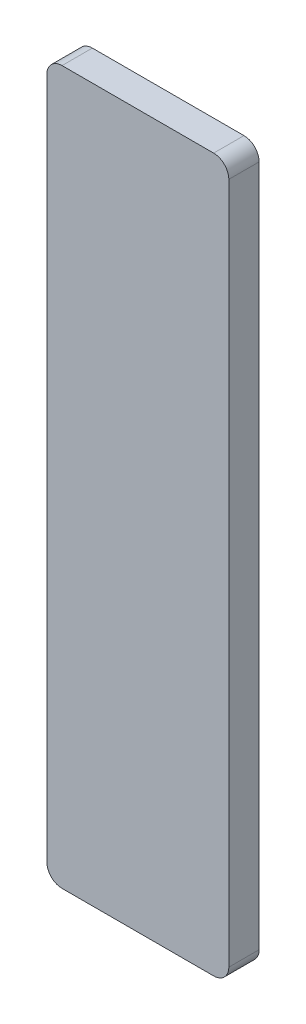
ISO-10303-21;
HEADER;
FILE_DESCRIPTION(('STEP AP214'),'2;1');
FILE_NAME('part.step','',(''),(''),'','','');
FILE_SCHEMA(('AUTOMOTIVE_DESIGN { 1 0 10303 214 1 1 1 1 }'));
ENDSEC;
DATA;
#1=APPLICATION_CONTEXT('core data for automotive mechanical design processes');
#2=APPLICATION_PROTOCOL_DEFINITION('international standard','automotive_design',2000,#1);
#3=PRODUCT_CONTEXT('',#1,'mechanical');
#4=PRODUCT('Part','Part','',(#3));
#5=PRODUCT_RELATED_PRODUCT_CATEGORY('part','',(#4));
#6=PRODUCT_DEFINITION_FORMATION('','',#4);
#7=PRODUCT_DEFINITION_CONTEXT('part definition',#1,'design');
#8=PRODUCT_DEFINITION('design','',#6,#7);
#9=PRODUCT_DEFINITION_SHAPE('','',#8);
#10=(LENGTH_UNIT() NAMED_UNIT(*) SI_UNIT(.MILLI.,.METRE.));
#11=(NAMED_UNIT(*) PLANE_ANGLE_UNIT() SI_UNIT($,.RADIAN.));
#12=(NAMED_UNIT(*) SI_UNIT($,.STERADIAN.) SOLID_ANGLE_UNIT());
#13=UNCERTAINTY_MEASURE_WITH_UNIT(LENGTH_MEASURE(1.E-05),#10,'distance_accuracy_value','');
#14=(GEOMETRIC_REPRESENTATION_CONTEXT(3) GLOBAL_UNCERTAINTY_ASSIGNED_CONTEXT((#13)) GLOBAL_UNIT_ASSIGNED_CONTEXT((#10,
#11,#12)) REPRESENTATION_CONTEXT('',''));
#15=CARTESIAN_POINT('',(0.,0.,0.));
#16=DIRECTION('',(0.,0.,1.));
#17=DIRECTION('',(1.,0.,0.));
#18=AXIS2_PLACEMENT_3D('',#15,#16,#17);
#19=CARTESIAN_POINT('',(-50.,-225.,20.));
#20=DIRECTION('',(0.,0.,-1.));
#21=DIRECTION('',(-1.,0.,0.));
#22=AXIS2_PLACEMENT_3D('',#19,#20,#21);
#23=CYLINDRICAL_SURFACE('',#22,10.);
#24=CARTESIAN_POINT('',(-50.,-225.,0.));
#25=DIRECTION('',(0.,0.,1.));
#26=DIRECTION('',(-1.,0.,0.));
#27=AXIS2_PLACEMENT_3D('',#24,#25,#26);
#28=CIRCLE('',#27,10.);
#29=CARTESIAN_POINT('',(-60.,-225.,0.));
#30=VERTEX_POINT('',#29);
#31=CARTESIAN_POINT('',(-50.,-235.,0.));
#32=VERTEX_POINT('',#31);
#33=EDGE_CURVE('E129',#30,#32,#28,.T.);
#34=ORIENTED_EDGE('',*,*,#33,.T.);
#35=DIRECTION('',(0.,0.,-1.));
#36=VECTOR('',#35,1.);
#37=CARTESIAN_POINT('',(-50.,-235.,20.));
#38=LINE('',#37,#36);
#39=CARTESIAN_POINT('',(-50.,-235.,20.));
#40=VERTEX_POINT('',#39);
#41=EDGE_CURVE('E11',#40,#32,#38,.T.);
#42=ORIENTED_EDGE('',*,*,#41,.F.);
#43=CARTESIAN_POINT('',(-50.,-225.,20.));
#44=DIRECTION('',(0.,0.,1.));
#45=DIRECTION('',(-1.,0.,0.));
#46=AXIS2_PLACEMENT_3D('',#43,#44,#45);
#47=CIRCLE('',#46,10.);
#48=CARTESIAN_POINT('',(-60.,-225.,20.));
#49=VERTEX_POINT('',#48);
#50=EDGE_CURVE('E143',#49,#40,#47,.T.);
#51=ORIENTED_EDGE('',*,*,#50,.F.);
#52=DIRECTION('',(0.,0.,-1.));
#53=VECTOR('',#52,1.);
#54=CARTESIAN_POINT('',(-60.,-225.,20.));
#55=LINE('',#54,#53);
#56=EDGE_CURVE('E125',#49,#30,#55,.T.);
#57=ORIENTED_EDGE('',*,*,#56,.T.);
#58=EDGE_LOOP('',(#34,#42,#51,#57));
#59=FACE_BOUND('',#58,.T.);
#60=ADVANCED_FACE('F33',(#59),#23,.T.);
#61=CARTESIAN_POINT('',(-50.,-235.,20.));
#62=DIRECTION('',(0.,1.,0.));
#63=DIRECTION('',(-1.,0.,0.));
#64=AXIS2_PLACEMENT_3D('',#61,#62,#63);
#65=PLANE('',#64);
#66=DIRECTION('',(1.,0.,0.));
#67=VECTOR('',#66,1.);
#68=CARTESIAN_POINT('',(-50.,-235.,0.));
#69=LINE('',#68,#67);
#70=CARTESIAN_POINT('',(50.,-235.,0.));
#71=VERTEX_POINT('',#70);
#72=EDGE_CURVE('E132',#32,#71,#69,.T.);
#73=ORIENTED_EDGE('',*,*,#72,.T.);
#74=DIRECTION('',(0.,0.,-1.));
#75=VECTOR('',#74,1.);
#76=CARTESIAN_POINT('',(50.,-235.,20.));
#77=LINE('',#76,#75);
#78=CARTESIAN_POINT('',(50.,-235.,20.));
#79=VERTEX_POINT('',#78);
#80=EDGE_CURVE('E41',#79,#71,#77,.T.);
#81=ORIENTED_EDGE('',*,*,#80,.F.);
#82=DIRECTION('',(1.,0.,0.));
#83=VECTOR('',#82,1.);
#84=CARTESIAN_POINT('',(-50.,-235.,20.));
#85=LINE('',#84,#83);
#86=EDGE_CURVE('E92',#40,#79,#85,.T.);
#87=ORIENTED_EDGE('',*,*,#86,.F.);
#88=ORIENTED_EDGE('',*,*,#41,.T.);
#89=EDGE_LOOP('',(#73,#81,#87,#88));
#90=FACE_BOUND('',#89,.T.);
#91=ADVANCED_FACE('F178',(#90),#65,.F.);
#92=CARTESIAN_POINT('',(50.,-225.,20.));
#93=DIRECTION('',(0.,0.,-1.));
#94=DIRECTION('',(-1.,0.,0.));
#95=AXIS2_PLACEMENT_3D('',#92,#93,#94);
#96=CYLINDRICAL_SURFACE('',#95,10.);
#97=CARTESIAN_POINT('',(50.,-225.,0.));
#98=DIRECTION('',(0.,0.,1.));
#99=DIRECTION('',(1.,0.,0.));
#100=AXIS2_PLACEMENT_3D('',#97,#98,#99);
#101=CIRCLE('',#100,10.);
#102=CARTESIAN_POINT('',(60.,-225.,0.));
#103=VERTEX_POINT('',#102);
#104=EDGE_CURVE('E134',#71,#103,#101,.T.);
#105=ORIENTED_EDGE('',*,*,#104,.T.);
#106=DIRECTION('',(0.,0.,-1.));
#107=VECTOR('',#106,1.);
#108=CARTESIAN_POINT('',(60.,-225.,20.));
#109=LINE('',#108,#107);
#110=CARTESIAN_POINT('',(60.,-225.,20.));
#111=VERTEX_POINT('',#110);
#112=EDGE_CURVE('E150',#111,#103,#109,.T.);
#113=ORIENTED_EDGE('',*,*,#112,.F.);
#114=CARTESIAN_POINT('',(50.,-225.,20.));
#115=DIRECTION('',(0.,0.,1.));
#116=DIRECTION('',(1.,0.,0.));
#117=AXIS2_PLACEMENT_3D('',#114,#115,#116);
#118=CIRCLE('',#117,10.);
#119=EDGE_CURVE('E158',#79,#111,#118,.T.);
#120=ORIENTED_EDGE('',*,*,#119,.F.);
#121=ORIENTED_EDGE('',*,*,#80,.T.);
#122=EDGE_LOOP('',(#105,#113,#120,#121));
#123=FACE_BOUND('',#122,.T.);
#124=ADVANCED_FACE('F156',(#123),#96,.T.);
#125=CARTESIAN_POINT('',(60.,-225.,20.));
#126=DIRECTION('',(-1.,0.,0.));
#127=DIRECTION('',(0.,-1.,0.));
#128=AXIS2_PLACEMENT_3D('',#125,#126,#127);
#129=PLANE('',#128);
#130=DIRECTION('',(0.,1.,0.));
#131=VECTOR('',#130,1.);
#132=CARTESIAN_POINT('',(60.,-225.,0.));
#133=LINE('',#132,#131);
#134=CARTESIAN_POINT('',(60.,225.,0.));
#135=VERTEX_POINT('',#134);
#136=EDGE_CURVE('E136',#103,#135,#133,.T.);
#137=ORIENTED_EDGE('',*,*,#136,.T.);
#138=DIRECTION('',(0.,0.,-1.));
#139=VECTOR('',#138,1.);
#140=CARTESIAN_POINT('',(60.,225.,20.));
#141=LINE('',#140,#139);
#142=CARTESIAN_POINT('',(60.,225.,20.));
#143=VERTEX_POINT('',#142);
#144=EDGE_CURVE('E147',#143,#135,#141,.T.);
#145=ORIENTED_EDGE('',*,*,#144,.F.);
#146=DIRECTION('',(0.,1.,0.));
#147=VECTOR('',#146,1.);
#148=CARTESIAN_POINT('',(60.,-225.,20.));
#149=LINE('',#148,#147);
#150=EDGE_CURVE('E170',#111,#143,#149,.T.);
#151=ORIENTED_EDGE('',*,*,#150,.F.);
#152=ORIENTED_EDGE('',*,*,#112,.T.);
#153=EDGE_LOOP('',(#137,#145,#151,#152));
#154=FACE_BOUND('',#153,.T.);
#155=ADVANCED_FACE('F166',(#154),#129,.F.);
#156=CARTESIAN_POINT('',(50.,225.,20.));
#157=DIRECTION('',(0.,0.,-1.));
#158=DIRECTION('',(-1.,0.,0.));
#159=AXIS2_PLACEMENT_3D('',#156,#157,#158);
#160=CYLINDRICAL_SURFACE('',#159,9.99999999999997);
#161=CARTESIAN_POINT('',(50.,225.,0.));
#162=DIRECTION('',(0.,0.,1.));
#163=DIRECTION('',(-1.,0.,0.));
#164=AXIS2_PLACEMENT_3D('',#161,#162,#163);
#165=CIRCLE('',#164,9.99999999999997);
#166=CARTESIAN_POINT('',(50.,235.,0.));
#167=VERTEX_POINT('',#166);
#168=EDGE_CURVE('E138',#135,#167,#165,.T.);
#169=ORIENTED_EDGE('',*,*,#168,.T.);
#170=DIRECTION('',(0.,0.,-1.));
#171=VECTOR('',#170,1.);
#172=CARTESIAN_POINT('',(50.,235.,20.));
#173=LINE('',#172,#171);
#174=CARTESIAN_POINT('',(50.,235.,20.));
#175=VERTEX_POINT('',#174);
#176=EDGE_CURVE('E120',#175,#167,#173,.T.);
#177=ORIENTED_EDGE('',*,*,#176,.F.);
#178=CARTESIAN_POINT('',(50.,225.,20.));
#179=DIRECTION('',(0.,0.,1.));
#180=DIRECTION('',(-1.,0.,0.));
#181=AXIS2_PLACEMENT_3D('',#178,#179,#180);
#182=CIRCLE('',#181,9.99999999999997);
#183=EDGE_CURVE('E111',#143,#175,#182,.T.);
#184=ORIENTED_EDGE('',*,*,#183,.F.);
#185=ORIENTED_EDGE('',*,*,#144,.T.);
#186=EDGE_LOOP('',(#169,#177,#184,#185));
#187=FACE_BOUND('',#186,.T.);
#188=ADVANCED_FACE('F169',(#187),#160,.T.);
#189=CARTESIAN_POINT('',(-50.,235.,20.));
#190=DIRECTION('',(0.,-1.,0.));
#191=DIRECTION('',(0.,0.,-1.));
#192=AXIS2_PLACEMENT_3D('',#189,#190,#191);
#193=PLANE('',#192);
#194=DIRECTION('',(-1.,0.,0.));
#195=VECTOR('',#194,1.);
#196=CARTESIAN_POINT('',(-50.,235.,0.));
#197=LINE('',#196,#195);
#198=CARTESIAN_POINT('',(-50.,235.,0.));
#199=VERTEX_POINT('',#198);
#200=EDGE_CURVE('E119',#167,#199,#197,.T.);
#201=ORIENTED_EDGE('',*,*,#200,.T.);
#202=DIRECTION('',(0.,0.,-1.));
#203=VECTOR('',#202,1.);
#204=CARTESIAN_POINT('',(-50.,235.,20.));
#205=LINE('',#204,#203);
#206=CARTESIAN_POINT('',(-50.,235.,20.));
#207=VERTEX_POINT('',#206);
#208=EDGE_CURVE('E116',#207,#199,#205,.T.);
#209=ORIENTED_EDGE('',*,*,#208,.F.);
#210=DIRECTION('',(-1.,0.,0.));
#211=VECTOR('',#210,1.);
#212=CARTESIAN_POINT('',(-50.,235.,20.));
#213=LINE('',#212,#211);
#214=EDGE_CURVE('E105',#175,#207,#213,.T.);
#215=ORIENTED_EDGE('',*,*,#214,.F.);
#216=ORIENTED_EDGE('',*,*,#176,.T.);
#217=EDGE_LOOP('',(#201,#209,#215,#216));
#218=FACE_BOUND('',#217,.T.);
#219=ADVANCED_FACE('F117',(#218),#193,.F.);
#220=CARTESIAN_POINT('',(-50.,225.,20.));
#221=DIRECTION('',(0.,0.,-1.));
#222=DIRECTION('',(-1.,0.,0.));
#223=AXIS2_PLACEMENT_3D('',#220,#221,#222);
#224=CYLINDRICAL_SURFACE('',#223,9.99999999999999);
#225=CARTESIAN_POINT('',(-50.,225.,0.));
#226=DIRECTION('',(0.,0.,1.));
#227=DIRECTION('',(1.,0.,0.));
#228=AXIS2_PLACEMENT_3D('',#225,#226,#227);
#229=CIRCLE('',#228,9.99999999999999);
#230=CARTESIAN_POINT('',(-60.,225.,0.));
#231=VERTEX_POINT('',#230);
#232=EDGE_CURVE('E78',#199,#231,#229,.T.);
#233=ORIENTED_EDGE('',*,*,#232,.T.);
#234=DIRECTION('',(0.,0.,-1.));
#235=VECTOR('',#234,1.);
#236=CARTESIAN_POINT('',(-60.,225.,20.));
#237=LINE('',#236,#235);
#238=CARTESIAN_POINT('',(-60.,225.,20.));
#239=VERTEX_POINT('',#238);
#240=EDGE_CURVE('E121',#239,#231,#237,.T.);
#241=ORIENTED_EDGE('',*,*,#240,.F.);
#242=CARTESIAN_POINT('',(-50.,225.,20.));
#243=DIRECTION('',(0.,0.,1.));
#244=DIRECTION('',(1.,0.,0.));
#245=AXIS2_PLACEMENT_3D('',#242,#243,#244);
#246=CIRCLE('',#245,9.99999999999999);
#247=EDGE_CURVE('E109',#207,#239,#246,.T.);
#248=ORIENTED_EDGE('',*,*,#247,.F.);
#249=ORIENTED_EDGE('',*,*,#208,.T.);
#250=EDGE_LOOP('',(#233,#241,#248,#249));
#251=FACE_BOUND('',#250,.T.);
#252=ADVANCED_FACE('F123',(#251),#224,.T.);
#253=CARTESIAN_POINT('',(-60.,-225.,20.));
#254=DIRECTION('',(1.,0.,0.));
#255=DIRECTION('',(0.,0.,-1.));
#256=AXIS2_PLACEMENT_3D('',#253,#254,#255);
#257=PLANE('',#256);
#258=DIRECTION('',(0.,-1.,0.));
#259=VECTOR('',#258,1.);
#260=CARTESIAN_POINT('',(-60.,-225.,0.));
#261=LINE('',#260,#259);
#262=EDGE_CURVE('E84',#231,#30,#261,.T.);
#263=ORIENTED_EDGE('',*,*,#262,.T.);
#264=ORIENTED_EDGE('',*,*,#56,.F.);
#265=DIRECTION('',(0.,-1.,0.));
#266=VECTOR('',#265,1.);
#267=CARTESIAN_POINT('',(-60.,-225.,20.));
#268=LINE('',#267,#266);
#269=EDGE_CURVE('E49',#239,#49,#268,.T.);
#270=ORIENTED_EDGE('',*,*,#269,.F.);
#271=ORIENTED_EDGE('',*,*,#240,.T.);
#272=EDGE_LOOP('',(#263,#264,#270,#271));
#273=FACE_BOUND('',#272,.T.);
#274=ADVANCED_FACE('F194',(#273),#257,.F.);
#275=CARTESIAN_POINT('',(-50.,-225.,20.));
#276=DIRECTION('',(0.,0.,-1.));
#277=DIRECTION('',(-1.,0.,0.));
#278=AXIS2_PLACEMENT_3D('',#275,#276,#277);
#279=PLANE('',#278);
#280=ORIENTED_EDGE('',*,*,#50,.T.);
#281=ORIENTED_EDGE('',*,*,#86,.T.);
#282=ORIENTED_EDGE('',*,*,#119,.T.);
#283=ORIENTED_EDGE('',*,*,#150,.T.);
#284=ORIENTED_EDGE('',*,*,#183,.T.);
#285=ORIENTED_EDGE('',*,*,#214,.T.);
#286=ORIENTED_EDGE('',*,*,#247,.T.);
#287=ORIENTED_EDGE('',*,*,#269,.T.);
#288=EDGE_LOOP('',(#280,#281,#282,#283,#284,#285,#286,#287));
#289=FACE_BOUND('',#288,.T.);
#290=ADVANCED_FACE('F107',(#289),#279,.F.);
#291=CARTESIAN_POINT('',(-50.,-225.,0.));
#292=DIRECTION('',(0.,0.,-1.));
#293=DIRECTION('',(-1.,0.,0.));
#294=AXIS2_PLACEMENT_3D('',#291,#292,#293);
#295=PLANE('',#294);
#296=ORIENTED_EDGE('',*,*,#33,.F.);
#297=ORIENTED_EDGE('',*,*,#262,.F.);
#298=ORIENTED_EDGE('',*,*,#232,.F.);
#299=ORIENTED_EDGE('',*,*,#200,.F.);
#300=ORIENTED_EDGE('',*,*,#168,.F.);
#301=ORIENTED_EDGE('',*,*,#136,.F.);
#302=ORIENTED_EDGE('',*,*,#104,.F.);
#303=ORIENTED_EDGE('',*,*,#72,.F.);
#304=EDGE_LOOP('',(#296,#297,#298,#299,#300,#301,#302,#303));
#305=FACE_BOUND('',#304,.T.);
#306=ADVANCED_FACE('F162',(#305),#295,.T.);
#307=CLOSED_SHELL('',(#60,#91,#124,#155,#188,#219,#252,#274,#290,#306));
#308=MANIFOLD_SOLID_BREP('B2',#307);
#309=ADVANCED_BREP_SHAPE_REPRESENTATION('',(#18,#308),#14);
#310=SHAPE_DEFINITION_REPRESENTATION(#9,#309);
ENDSEC;
END-ISO-10303-21;
